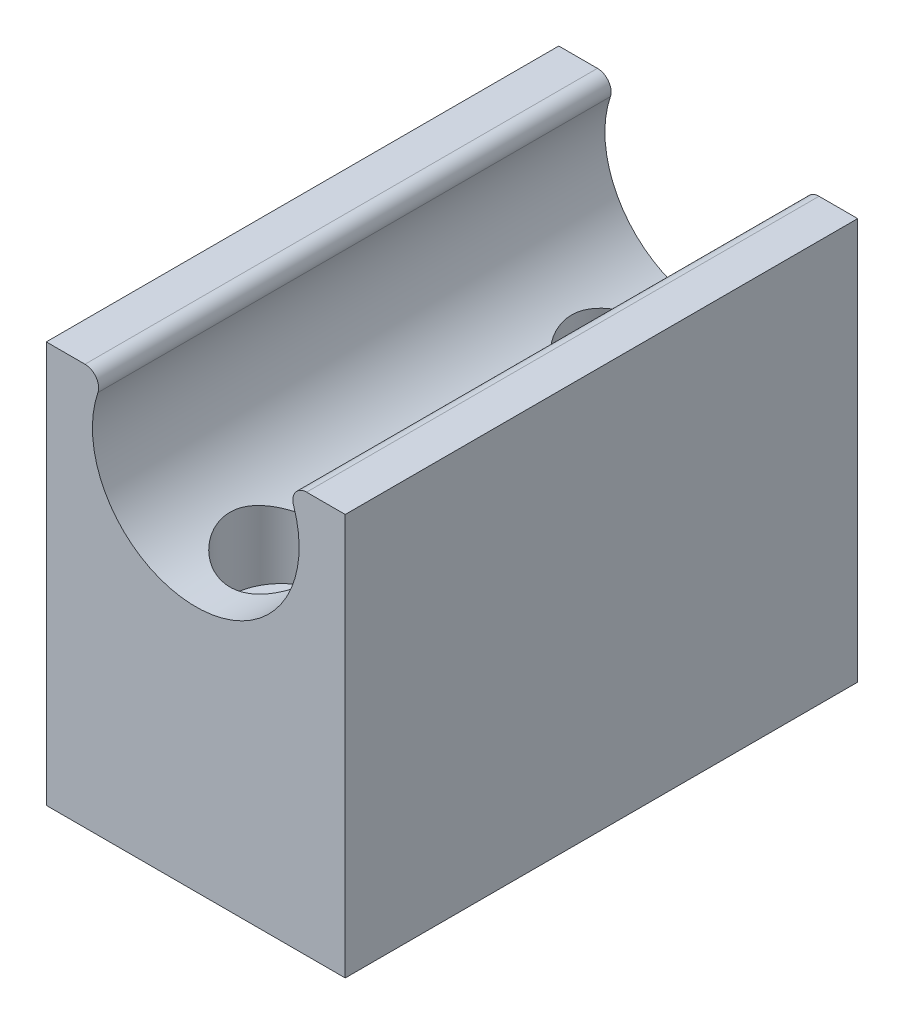
ISO-10303-21;
HEADER;
FILE_DESCRIPTION(('STEP AP214'),'2;1');
FILE_NAME('part.step','',(''),(''),'','','');
FILE_SCHEMA(('AUTOMOTIVE_DESIGN { 1 0 10303 214 1 1 1 1 }'));
ENDSEC;
DATA;
#1=APPLICATION_CONTEXT('core data for automotive mechanical design processes');
#2=APPLICATION_PROTOCOL_DEFINITION('international standard','automotive_design',2000,#1);
#3=PRODUCT_CONTEXT('',#1,'mechanical');
#4=PRODUCT('Part','Part','',(#3));
#5=PRODUCT_RELATED_PRODUCT_CATEGORY('part','',(#4));
#6=PRODUCT_DEFINITION_FORMATION('','',#4);
#7=PRODUCT_DEFINITION_CONTEXT('part definition',#1,'design');
#8=PRODUCT_DEFINITION('design','',#6,#7);
#9=PRODUCT_DEFINITION_SHAPE('','',#8);
#10=(LENGTH_UNIT() NAMED_UNIT(*) SI_UNIT(.MILLI.,.METRE.));
#11=(NAMED_UNIT(*) PLANE_ANGLE_UNIT() SI_UNIT($,.RADIAN.));
#12=(NAMED_UNIT(*) SI_UNIT($,.STERADIAN.) SOLID_ANGLE_UNIT());
#13=UNCERTAINTY_MEASURE_WITH_UNIT(LENGTH_MEASURE(1.E-05),#10,'distance_accuracy_value','');
#14=(GEOMETRIC_REPRESENTATION_CONTEXT(3) GLOBAL_UNCERTAINTY_ASSIGNED_CONTEXT((#13)) GLOBAL_UNIT_ASSIGNED_CONTEXT((#10,
#11,#12)) REPRESENTATION_CONTEXT('',''));
#15=CARTESIAN_POINT('',(0.,0.,0.));
#16=DIRECTION('',(0.,0.,1.));
#17=DIRECTION('',(1.,0.,0.));
#18=AXIS2_PLACEMENT_3D('',#15,#16,#17);
#19=CARTESIAN_POINT('',(-8.75,-11.75,30.));
#20=DIRECTION('',(1.,0.,0.));
#21=DIRECTION('',(0.,0.,-1.));
#22=AXIS2_PLACEMENT_3D('',#19,#20,#21);
#23=PLANE('',#22);
#24=DIRECTION('',(0.,-1.,0.));
#25=VECTOR('',#24,1.);
#26=CARTESIAN_POINT('',(-8.75,-11.75,0.));
#27=LINE('',#26,#25);
#28=CARTESIAN_POINT('',(-8.75,11.75,0.));
#29=VERTEX_POINT('',#28);
#30=CARTESIAN_POINT('',(-8.75,-11.75,0.));
#31=VERTEX_POINT('',#30);
#32=EDGE_CURVE('E125',#29,#31,#27,.T.);
#33=ORIENTED_EDGE('',*,*,#32,.T.);
#34=DIRECTION('',(0.,0.,-1.));
#35=VECTOR('',#34,1.);
#36=CARTESIAN_POINT('',(-8.75,-11.75,30.));
#37=LINE('',#36,#35);
#38=CARTESIAN_POINT('',(-8.75,-11.75,30.));
#39=VERTEX_POINT('',#38);
#40=EDGE_CURVE('E108',#39,#31,#37,.T.);
#41=ORIENTED_EDGE('',*,*,#40,.F.);
#42=DIRECTION('',(0.,-1.,0.));
#43=VECTOR('',#42,1.);
#44=CARTESIAN_POINT('',(-8.75,-11.75,30.));
#45=LINE('',#44,#43);
#46=CARTESIAN_POINT('',(-8.75,11.75,30.));
#47=VERTEX_POINT('',#46);
#48=EDGE_CURVE('E114',#47,#39,#45,.T.);
#49=ORIENTED_EDGE('',*,*,#48,.F.);
#50=DIRECTION('',(0.,0.,-1.));
#51=VECTOR('',#50,1.);
#52=CARTESIAN_POINT('',(-8.75,11.75,30.));
#53=LINE('',#52,#51);
#54=EDGE_CURVE('E207',#47,#29,#53,.T.);
#55=ORIENTED_EDGE('',*,*,#54,.T.);
#56=EDGE_LOOP('',(#33,#41,#49,#55));
#57=FACE_BOUND('',#56,.T.);
#58=ADVANCED_FACE('F34',(#57),#23,.F.);
#59=CARTESIAN_POINT('',(8.75,-11.75,30.));
#60=DIRECTION('',(0.,1.,0.));
#61=DIRECTION('',(-1.,0.,0.));
#62=AXIS2_PLACEMENT_3D('',#59,#60,#61);
#63=PLANE('',#62);
#64=CARTESIAN_POINT('',(0.,-11.75,5.));
#65=DIRECTION('',(0.,1.,0.));
#66=DIRECTION('',(-1.,0.,0.));
#67=AXIS2_PLACEMENT_3D('',#64,#65,#66);
#68=CIRCLE('',#67,1.55);
#69=CARTESIAN_POINT('',(-1.55000000000001,-11.75,5.));
#70=VERTEX_POINT('',#69);
#71=EDGE_CURVE('E238',#70,#70,#68,.T.);
#72=ORIENTED_EDGE('',*,*,#71,.T.);
#73=EDGE_LOOP('',(#72));
#74=FACE_BOUND('',#73,.T.);
#75=CARTESIAN_POINT('',(0.,-11.75,25.));
#76=DIRECTION('',(0.,1.,0.));
#77=DIRECTION('',(-1.,0.,0.));
#78=AXIS2_PLACEMENT_3D('',#75,#76,#77);
#79=CIRCLE('',#78,1.55);
#80=CARTESIAN_POINT('',(-1.55000000000001,-11.75,25.));
#81=VERTEX_POINT('',#80);
#82=EDGE_CURVE('E235',#81,#81,#79,.T.);
#83=ORIENTED_EDGE('',*,*,#82,.T.);
#84=EDGE_LOOP('',(#83));
#85=FACE_BOUND('',#84,.T.);
#86=DIRECTION('',(1.,0.,0.));
#87=VECTOR('',#86,1.);
#88=CARTESIAN_POINT('',(8.75,-11.75,0.));
#89=LINE('',#88,#87);
#90=CARTESIAN_POINT('',(8.75,-11.75,0.));
#91=VERTEX_POINT('',#90);
#92=EDGE_CURVE('E213',#31,#91,#89,.T.);
#93=ORIENTED_EDGE('',*,*,#92,.T.);
#94=DIRECTION('',(0.,0.,-1.));
#95=VECTOR('',#94,1.);
#96=CARTESIAN_POINT('',(8.75,-11.75,30.));
#97=LINE('',#96,#95);
#98=CARTESIAN_POINT('',(8.75,-11.75,30.));
#99=VERTEX_POINT('',#98);
#100=EDGE_CURVE('E111',#99,#91,#97,.T.);
#101=ORIENTED_EDGE('',*,*,#100,.F.);
#102=DIRECTION('',(1.,0.,0.));
#103=VECTOR('',#102,1.);
#104=CARTESIAN_POINT('',(8.75,-11.75,30.));
#105=LINE('',#104,#103);
#106=EDGE_CURVE('E104',#39,#99,#105,.T.);
#107=ORIENTED_EDGE('',*,*,#106,.F.);
#108=ORIENTED_EDGE('',*,*,#40,.T.);
#109=EDGE_LOOP('',(#93,#101,#107,#108));
#110=FACE_BOUND('',#109,.T.);
#111=ADVANCED_FACE('F106',(#74,#85,#110),#63,.F.);
#112=CARTESIAN_POINT('',(8.75,-11.75,30.));
#113=DIRECTION('',(-1.,0.,0.));
#114=DIRECTION('',(0.,0.,1.));
#115=AXIS2_PLACEMENT_3D('',#112,#113,#114);
#116=PLANE('',#115);
#117=DIRECTION('',(0.,1.,0.));
#118=VECTOR('',#117,1.);
#119=CARTESIAN_POINT('',(8.75,-11.75,0.));
#120=LINE('',#119,#118);
#121=CARTESIAN_POINT('',(8.75,11.75,0.));
#122=VERTEX_POINT('',#121);
#123=EDGE_CURVE('E215',#91,#122,#120,.T.);
#124=ORIENTED_EDGE('',*,*,#123,.T.);
#125=DIRECTION('',(0.,0.,-1.));
#126=VECTOR('',#125,1.);
#127=CARTESIAN_POINT('',(8.75,11.75,30.));
#128=LINE('',#127,#126);
#129=CARTESIAN_POINT('',(8.75,11.75,30.));
#130=VERTEX_POINT('',#129);
#131=EDGE_CURVE('E130',#130,#122,#128,.T.);
#132=ORIENTED_EDGE('',*,*,#131,.F.);
#133=DIRECTION('',(0.,1.,0.));
#134=VECTOR('',#133,1.);
#135=CARTESIAN_POINT('',(8.75,-11.75,30.));
#136=LINE('',#135,#134);
#137=EDGE_CURVE('E113',#99,#130,#136,.T.);
#138=ORIENTED_EDGE('',*,*,#137,.F.);
#139=ORIENTED_EDGE('',*,*,#100,.T.);
#140=EDGE_LOOP('',(#124,#132,#138,#139));
#141=FACE_BOUND('',#140,.T.);
#142=ADVANCED_FACE('F187',(#141),#116,.F.);
#143=CARTESIAN_POINT('',(8.75,11.75,30.));
#144=DIRECTION('',(0.,-1.,0.));
#145=DIRECTION('',(1.,0.,0.));
#146=AXIS2_PLACEMENT_3D('',#143,#144,#145);
#147=PLANE('',#146);
#148=DIRECTION('',(-1.,0.,0.));
#149=VECTOR('',#148,1.);
#150=CARTESIAN_POINT('',(8.75,11.75,0.));
#151=LINE('',#150,#149);
#152=CARTESIAN_POINT('',(6.48484038670802,11.75,0.));
#153=VERTEX_POINT('',#152);
#154=EDGE_CURVE('E217',#122,#153,#151,.T.);
#155=ORIENTED_EDGE('',*,*,#154,.T.);
#156=DIRECTION('',(0.,0.,-1.));
#157=VECTOR('',#156,1.);
#158=CARTESIAN_POINT('',(6.48484038670801,11.75,30.));
#159=LINE('',#158,#157);
#160=CARTESIAN_POINT('',(6.48484038670802,11.75,30.));
#161=VERTEX_POINT('',#160);
#162=EDGE_CURVE('E59',#153,#161,#159,.F.);
#163=ORIENTED_EDGE('',*,*,#162,.T.);
#164=DIRECTION('',(-1.,0.,0.));
#165=VECTOR('',#164,1.);
#166=CARTESIAN_POINT('',(8.75,11.75,30.));
#167=LINE('',#166,#165);
#168=EDGE_CURVE('E201',#130,#161,#167,.T.);
#169=ORIENTED_EDGE('',*,*,#168,.F.);
#170=ORIENTED_EDGE('',*,*,#131,.T.);
#171=EDGE_LOOP('',(#155,#163,#169,#170));
#172=FACE_BOUND('',#171,.T.);
#173=ADVANCED_FACE('F180',(#172),#147,.F.);
#174=CARTESIAN_POINT('',(0.,8.74334072432542,30.));
#175=DIRECTION('',(0.,0.,-1.));
#176=DIRECTION('',(-1.,0.,0.));
#177=AXIS2_PLACEMENT_3D('',#174,#175,#176);
#178=CYLINDRICAL_SURFACE('',#177,6.05);
#179=CARTESIAN_POINT('',(-3.00000000000001,3.48953258165406,5.));
#180=CARTESIAN_POINT('',(-2.99999906809475,3.48953157913956,4.92169958919087));
#181=CARTESIAN_POINT('',(-2.99692823095396,3.48777414298011,4.8433884027717));
#182=CARTESIAN_POINT('',(-2.98469593638343,3.48081944162537,4.68738634838371));
#183=CARTESIAN_POINT('',(-2.97553158010728,3.47562053923982,4.60969579347636));
#184=CARTESIAN_POINT('',(-2.93900669661294,3.45509131915615,4.37823264692065));
#185=CARTESIAN_POINT('',(-2.90261462142552,3.43482898217021,4.22621080798807));
#186=CARTESIAN_POINT('',(-2.80775426000345,3.38406506999434,3.93213582389355));
#187=CARTESIAN_POINT('',(-2.74940180836731,3.35361731198791,3.79003493192759));
#188=CARTESIAN_POINT('',(-2.6126308262436,3.28600895912264,3.51764153154146));
#189=CARTESIAN_POINT('',(-2.53421149634938,3.2488480968504,3.38734949383212));
#190=CARTESIAN_POINT('',(-2.35207791908092,3.16831517397319,3.13065008506965));
#191=CARTESIAN_POINT('',(-2.24682870416993,3.12468380986631,3.00541338670911));
#192=CARTESIAN_POINT('',(-2.01721665974257,3.03822100989974,2.77345914021974));
#193=CARTESIAN_POINT('',(-1.89284448548843,2.99538997667303,2.66675070079675));
#194=CARTESIAN_POINT('',(-1.6184786687261,2.9119698406551,2.46799246796855));
#195=CARTESIAN_POINT('',(-1.46733550477812,2.87171550875706,2.37737580991347));
#196=CARTESIAN_POINT('',(-1.14958038611187,2.80134027674662,2.22338801387059));
#197=CARTESIAN_POINT('',(-0.982978114604608,2.77121308718585,2.15999995877159));
#198=CARTESIAN_POINT('',(-0.651423860859746,2.72635339043718,2.06688241456696));
#199=CARTESIAN_POINT('',(-0.487176521968729,2.71068891627855,2.035103075595));
#200=CARTESIAN_POINT('',(-0.154991313461266,2.69304502185751,1.99936086132741));
#201=CARTESIAN_POINT('',(0.0129443057167053,2.69105747710679,1.99538147204299));
#202=CARTESIAN_POINT('',(0.332354445423699,2.70054388500346,2.0145461562578));
#203=CARTESIAN_POINT('',(0.484007962523596,2.71088057898079,2.035398591201));
#204=CARTESIAN_POINT('',(0.781333146292692,2.74214340899169,2.09954285160153));
#205=CARTESIAN_POINT('',(0.927004365054741,2.76307033638098,2.14283635397461));
#206=CARTESIAN_POINT('',(1.21079360349511,2.81395853569769,2.25093276304642));
#207=CARTESIAN_POINT('',(1.3487772176401,2.84404226606314,2.31602850637883));
#208=CARTESIAN_POINT('',(1.61219900252272,2.91052002855572,2.46548322192162));
#209=CARTESIAN_POINT('',(1.7376326351692,2.94691633040679,2.5498491263071));
#210=CARTESIAN_POINT('',(1.98489139887648,3.02660097643339,2.74451485261607));
#211=CARTESIAN_POINT('',(2.10528603368982,3.07021552937018,2.85650064321701));
#212=CARTESIAN_POINT('',(2.32634259539988,3.15721781997606,3.09866712688479));
#213=CARTESIAN_POINT('',(2.42698977332745,3.2006053647349,3.22886129604987));
#214=CARTESIAN_POINT('',(2.61181236808332,3.28514372249205,3.51375228475325));
#215=CARTESIAN_POINT('',(2.69458875370376,3.32599147028795,3.66946515757608));
#216=CARTESIAN_POINT('',(2.79773152700655,3.37894993238942,3.91347968465842));
#217=CARTESIAN_POINT('',(2.82861305914926,3.39521974926586,3.99657713022711));
#218=CARTESIAN_POINT('',(2.88302399044353,3.42435327138516,4.16570628855268));
#219=CARTESIAN_POINT('',(2.90655788697888,3.43721905944712,4.25173617049391));
#220=CARTESIAN_POINT('',(2.94439298418654,3.45812739382683,4.41919564061344));
#221=CARTESIAN_POINT('',(2.95927300565853,3.46646881462058,4.50045769692464));
#222=CARTESIAN_POINT('',(2.98229098239219,3.47944333667072,4.66418766032683));
#223=CARTESIAN_POINT('',(2.99043241562099,3.48407835086161,4.74665492298273));
#224=CARTESIAN_POINT('',(2.99985479803173,3.48944662144606,4.9120840314402));
#225=CARTESIAN_POINT('',(3.00113816073897,3.49018125048141,4.99504569295921));
#226=CARTESIAN_POINT('',(2.99683992542914,3.48772962864214,5.16070691994721));
#227=CARTESIAN_POINT('',(2.99125877282282,3.48454363216111,5.24340650207242));
#228=CARTESIAN_POINT('',(2.9662363390353,3.47035895456734,5.4724269839308));
#229=CARTESIAN_POINT('',(2.93935618478279,3.455191754699,5.61775608758309));
#230=CARTESIAN_POINT('',(2.86511831894805,3.41461276501557,5.90147917235802));
#231=CARTESIAN_POINT('',(2.8177541113851,3.38919772553983,6.03987093793691));
#232=CARTESIAN_POINT('',(2.70158216238737,3.32961789660782,6.31320616371009));
#233=CARTESIAN_POINT('',(2.63188161552254,3.29510191178194,6.44769186293141));
#234=CARTESIAN_POINT('',(2.47379628699685,3.22152697776825,6.70382415113317));
#235=CARTESIAN_POINT('',(2.38540193064304,3.18246570518016,6.82546411266343));
#236=CARTESIAN_POINT('',(2.17966693882561,3.09839991039797,7.06818278242263));
#237=CARTESIAN_POINT('',(2.06009917998589,3.05325741473383,7.18733486504638));
#238=CARTESIAN_POINT('',(1.80193286915294,2.96630981713788,7.40447397825602));
#239=CARTESIAN_POINT('',(1.66332824552304,2.92450578673379,7.5024542305182));
#240=CARTESIAN_POINT('',(1.36627957215119,2.84759121188405,7.67649285211116));
#241=CARTESIAN_POINT('',(1.20742925954394,2.81267203405631,7.75194834478087));
#242=CARTESIAN_POINT('',(0.87706101921446,2.75491127579537,7.87432043564501));
#243=CARTESIAN_POINT('',(0.705554178032903,2.73205926489916,7.92126168590921));
#244=CARTESIAN_POINT('',(0.37155100032505,2.70264753034033,7.98128875886027));
#245=CARTESIAN_POINT('',(0.209650096715313,2.69479710701199,7.99706115372735));
#246=CARTESIAN_POINT('',(-0.114649777075985,2.69225728281536,8.00218671215331));
#247=CARTESIAN_POINT('',(-0.277048560137958,2.69756342842318,7.99154881564504));
#248=CARTESIAN_POINT('',(-0.586778482700871,2.71998790279766,7.94595117695327));
#249=CARTESIAN_POINT('',(-0.734408053014399,2.73632696613152,7.91259479624071));
#250=CARTESIAN_POINT('',(-1.02174485627361,2.77847380468405,7.82464556498565));
#251=CARTESIAN_POINT('',(-1.16145093163362,2.80428295934582,7.7700496205521));
#252=CARTESIAN_POINT('',(-1.43574865278082,2.8644210499404,7.63870224312811));
#253=CARTESIAN_POINT('',(-1.56985828254569,2.89907000153997,7.56109522952421));
#254=CARTESIAN_POINT('',(-1.82371481519904,2.97323838355409,7.38700154070093));
#255=CARTESIAN_POINT('',(-1.94345506734849,3.01276005223672,7.2905061771253));
#256=CARTESIAN_POINT('',(-2.17753140543737,3.09729599644537,7.07042250074851));
#257=CARTESIAN_POINT('',(-2.29018595430991,3.14246882951173,6.9451052704169));
#258=CARTESIAN_POINT('',(-2.49350662440992,3.22997466248258,6.67653596788057));
#259=CARTESIAN_POINT('',(-2.5841538376268,3.27230519794687,6.53326863258302));
#260=CARTESIAN_POINT('',(-2.7026618493872,3.33038077366505,6.30509672838674));
#261=CARTESIAN_POINT('',(-2.73965739745578,3.34906593554201,6.22556757982067));
#262=CARTESIAN_POINT('',(-2.8067064671721,3.38364657678948,6.06306692411298));
#263=CARTESIAN_POINT('',(-2.83676356155061,3.39954349085993,5.98009721465641));
#264=CARTESIAN_POINT('',(-2.88950286251377,3.42787565515903,5.81151459588914));
#265=CARTESIAN_POINT('',(-2.91220409038983,3.44031982154721,5.72590914097619));
#266=CARTESIAN_POINT('',(-2.94999720196722,3.46124962907184,5.55260406566714));
#267=CARTESIAN_POINT('',(-2.96509443701473,3.46973805376498,5.46490596363331));
#268=CARTESIAN_POINT('',(-2.9841585341751,3.48051105265958,5.31424298296345));
#269=CARTESIAN_POINT('',(-2.99009363222025,3.48388631132452,5.25159698145113));
#270=CARTESIAN_POINT('',(-2.99801486981297,3.48839755268586,5.1259696588871));
#271=CARTESIAN_POINT('',(-3.00000074966585,3.4895333881211,5.06298831605687));
#272=CARTESIAN_POINT('',(-3.00000000000001,3.48953258165406,5.));
#273=B_SPLINE_CURVE_WITH_KNOTS('',3,(#179,#180,#181,#182,#183,#184,#185,#186,#187,#188,#189,
#190,#191,#192,#193,#194,#195,#196,#197,#198,#199,#200,#201,#202,#203,#204,#205,#206,#207,#208,
#209,#210,#211,#212,#213,#214,#215,#216,#217,#218,#219,#220,#221,#222,#223,#224,#225,#226,#227,
#228,#229,#230,#231,#232,#233,#234,#235,#236,#237,#238,#239,#240,#241,#242,#243,#244,#245,#246,
#247,#248,#249,#250,#251,#252,#253,#254,#255,#256,#257,#258,#259,#260,#261,#262,#263,#264,#265,
#266,#267,#268,#269,#270,#271,#272),.UNSPECIFIED.,.T.,.F.,(4,2,2,2,2,2,2,2,2,2,2,2,2,2,2,2,2,2,
2,2,2,2,2,2,2,2,2,2,2,2,2,2,2,2,2,2,2,2,2,2,2,2,2,2,2,2,4),(0.,0.234832216291769,
0.469776228416026,0.940084921369962,1.40794687267444,1.87582746515457,2.38162825856337,
2.88767700975197,3.42713981376168,3.96626696343198,4.46756050795178,4.96855624400314,
5.42668515066377,5.88484829608603,6.34943002572839,6.81417914620369,7.3223226734741,
7.83084428994023,8.37073413562579,8.64079160168459,8.91068344385044,9.15943377973968,
9.40805564867155,9.65659001563011,9.90510825704555,10.3486118593694,10.792256210488,
11.256480421302,11.7209429792526,12.2427974264193,12.7648187025477,13.2997656797885,
13.8342495063932,14.320212475525,14.8060109677164,15.2606580113594,15.7153713066187,
16.1897374121279,16.664322233839,17.1854483024488,17.7070205341594,17.9757512635118,
18.2443433085238,18.5122351623385,18.7799382216341,18.9688352289957,19.1577446575321),.UNSPECIFIED.);
#274=CARTESIAN_POINT('',(-3.00000000000001,3.48953258165406,5.));
#275=VERTEX_POINT('',#274);
#276=EDGE_CURVE('E151',#275,#275,#273,.T.);
#277=ORIENTED_EDGE('',*,*,#276,.T.);
#278=EDGE_LOOP('',(#277));
#279=FACE_BOUND('',#278,.T.);
#280=CARTESIAN_POINT('',(-3.00000000000001,3.48953258165406,25.));
#281=CARTESIAN_POINT('',(-2.99999906809475,3.48953157913956,24.9216995891909));
#282=CARTESIAN_POINT('',(-2.99692823095396,3.48777414298011,24.8433884027717));
#283=CARTESIAN_POINT('',(-2.98469593638343,3.48081944162537,24.6873863483837));
#284=CARTESIAN_POINT('',(-2.97553158010728,3.47562053923982,24.6096957934764));
#285=CARTESIAN_POINT('',(-2.93900669661294,3.45509131915615,24.3782326469206));
#286=CARTESIAN_POINT('',(-2.90261462142552,3.43482898217021,24.2262108079881));
#287=CARTESIAN_POINT('',(-2.80775426000345,3.38406506999434,23.9321358238935));
#288=CARTESIAN_POINT('',(-2.74940180836731,3.35361731198791,23.7900349319276));
#289=CARTESIAN_POINT('',(-2.61263082624361,3.28600895912264,23.5176415315415));
#290=CARTESIAN_POINT('',(-2.53421149634938,3.2488480968504,23.3873494938321));
#291=CARTESIAN_POINT('',(-2.35207791908092,3.16831517397319,23.1306500850696));
#292=CARTESIAN_POINT('',(-2.24682870416993,3.12468380986631,23.0054133867091));
#293=CARTESIAN_POINT('',(-2.01721665974257,3.03822100989974,22.7734591402197));
#294=CARTESIAN_POINT('',(-1.89284448548843,2.99538997667303,22.6667507007967));
#295=CARTESIAN_POINT('',(-1.6184786687261,2.9119698406551,22.4679924679685));
#296=CARTESIAN_POINT('',(-1.46733550477812,2.87171550875706,22.3773758099135));
#297=CARTESIAN_POINT('',(-1.14958038611187,2.80134027674662,22.2233880138706));
#298=CARTESIAN_POINT('',(-0.982978114604611,2.77121308718585,22.1599999587716));
#299=CARTESIAN_POINT('',(-0.651423860859749,2.72635339043719,22.066882414567));
#300=CARTESIAN_POINT('',(-0.487176521968732,2.71068891627855,22.035103075595));
#301=CARTESIAN_POINT('',(-0.154991313461269,2.69304502185751,21.9993608613274));
#302=CARTESIAN_POINT('',(0.012944305716702,2.69105747710679,21.995381472043));
#303=CARTESIAN_POINT('',(0.332354445423696,2.70054388500346,22.0145461562578));
#304=CARTESIAN_POINT('',(0.484007962523593,2.71088057898079,22.035398591201));
#305=CARTESIAN_POINT('',(0.781333146292688,2.74214340899169,22.0995428516015));
#306=CARTESIAN_POINT('',(0.927004365054738,2.76307033638098,22.1428363539746));
#307=CARTESIAN_POINT('',(1.21079360349511,2.81395853569769,22.2509327630464));
#308=CARTESIAN_POINT('',(1.34877721764009,2.84404226606313,22.3160285063788));
#309=CARTESIAN_POINT('',(1.61219900252272,2.91052002855572,22.4654832219216));
#310=CARTESIAN_POINT('',(1.7376326351692,2.94691633040679,22.5498491263071));
#311=CARTESIAN_POINT('',(1.98489139887647,3.02660097643338,22.7445148526161));
#312=CARTESIAN_POINT('',(2.10528603368981,3.07021552937018,22.856500643217));
#313=CARTESIAN_POINT('',(2.32634259539987,3.15721781997606,23.0986671268848));
#314=CARTESIAN_POINT('',(2.42698977332745,3.2006053647349,23.2288612960499));
#315=CARTESIAN_POINT('',(2.61181236808332,3.28514372249205,23.5137522847533));
#316=CARTESIAN_POINT('',(2.69458875370376,3.32599147028795,23.6694651575761));
#317=CARTESIAN_POINT('',(2.79773152700655,3.37894993238942,23.9134796846584));
#318=CARTESIAN_POINT('',(2.82861305914926,3.39521974926586,23.9965771302271));
#319=CARTESIAN_POINT('',(2.88302399044353,3.42435327138516,24.1657062885527));
#320=CARTESIAN_POINT('',(2.90655788697888,3.43721905944712,24.2517361704939));
#321=CARTESIAN_POINT('',(2.94439298418654,3.45812739382683,24.4191956406134));
#322=CARTESIAN_POINT('',(2.95927300565853,3.46646881462058,24.5004576969246));
#323=CARTESIAN_POINT('',(2.98229098239219,3.47944333667072,24.6641876603268));
#324=CARTESIAN_POINT('',(2.99043241562099,3.48407835086161,24.7466549229827));
#325=CARTESIAN_POINT('',(2.99985479803173,3.48944662144606,24.9120840314402));
#326=CARTESIAN_POINT('',(3.00113816073897,3.49018125048141,24.9950456929592));
#327=CARTESIAN_POINT('',(2.99683992542914,3.48772962864215,25.1607069199472));
#328=CARTESIAN_POINT('',(2.99125877282282,3.48454363216112,25.2434065020724));
#329=CARTESIAN_POINT('',(2.9662363390353,3.47035895456734,25.4724269839308));
#330=CARTESIAN_POINT('',(2.93935618478279,3.455191754699,25.6177560875831));
#331=CARTESIAN_POINT('',(2.86511831894805,3.41461276501557,25.901479172358));
#332=CARTESIAN_POINT('',(2.8177541113851,3.38919772553983,26.0398709379369));
#333=CARTESIAN_POINT('',(2.70158216238737,3.32961789660782,26.3132061637101));
#334=CARTESIAN_POINT('',(2.63188161552254,3.29510191178194,26.4476918629314));
#335=CARTESIAN_POINT('',(2.47379628699685,3.22152697776825,26.7038241511332));
#336=CARTESIAN_POINT('',(2.38540193064304,3.18246570518016,26.8254641126634));
#337=CARTESIAN_POINT('',(2.17966693882561,3.09839991039797,27.0681827824226));
#338=CARTESIAN_POINT('',(2.0600991799859,3.05325741473383,27.1873348650464));
#339=CARTESIAN_POINT('',(1.80193286915294,2.96630981713788,27.404473978256));
#340=CARTESIAN_POINT('',(1.66332824552304,2.92450578673379,27.5024542305182));
#341=CARTESIAN_POINT('',(1.36627957215119,2.84759121188406,27.6764928521112));
#342=CARTESIAN_POINT('',(1.20742925954394,2.81267203405631,27.7519483447809));
#343=CARTESIAN_POINT('',(0.877061019214466,2.75491127579537,27.874320435645));
#344=CARTESIAN_POINT('',(0.705554178032909,2.73205926489916,27.9212616859092));
#345=CARTESIAN_POINT('',(0.371551000325056,2.70264753034033,27.9812887588603));
#346=CARTESIAN_POINT('',(0.209650096715318,2.69479710701199,27.9970611537273));
#347=CARTESIAN_POINT('',(-0.114649777075981,2.69225728281536,28.0021867121533));
#348=CARTESIAN_POINT('',(-0.277048560137953,2.69756342842318,27.991548815645));
#349=CARTESIAN_POINT('',(-0.586778482700867,2.71998790279765,27.9459511769533));
#350=CARTESIAN_POINT('',(-0.734408053014395,2.73632696613151,27.9125947962407));
#351=CARTESIAN_POINT('',(-1.02174485627361,2.77847380468405,27.8246455649857));
#352=CARTESIAN_POINT('',(-1.16145093163361,2.80428295934582,27.7700496205521));
#353=CARTESIAN_POINT('',(-1.43574865278081,2.8644210499404,27.6387022431281));
#354=CARTESIAN_POINT('',(-1.56985828254569,2.89907000153997,27.5610952295242));
#355=CARTESIAN_POINT('',(-1.82371481519904,2.9732383835541,27.3870015407009));
#356=CARTESIAN_POINT('',(-1.94345506734849,3.01276005223672,27.2905061771253));
#357=CARTESIAN_POINT('',(-2.17753140543736,3.09729599644537,27.0704225007485));
#358=CARTESIAN_POINT('',(-2.2901859543099,3.14246882951173,26.9451052704169));
#359=CARTESIAN_POINT('',(-2.49350662440992,3.22997466248258,26.6765359678806));
#360=CARTESIAN_POINT('',(-2.58415383762679,3.27230519794686,26.533268632583));
#361=CARTESIAN_POINT('',(-2.7026618493872,3.33038077366505,26.3050967283867));
#362=CARTESIAN_POINT('',(-2.73965739745577,3.34906593554201,26.2255675798207));
#363=CARTESIAN_POINT('',(-2.80670646717209,3.38364657678947,26.063066924113));
#364=CARTESIAN_POINT('',(-2.8367635615506,3.39954349085993,25.9800972146564));
#365=CARTESIAN_POINT('',(-2.88950286251377,3.42787565515903,25.8115145958891));
#366=CARTESIAN_POINT('',(-2.91220409038983,3.44031982154721,25.7259091409762));
#367=CARTESIAN_POINT('',(-2.94999720196722,3.46124962907184,25.5526040656671));
#368=CARTESIAN_POINT('',(-2.96509443701473,3.46973805376498,25.4649059636333));
#369=CARTESIAN_POINT('',(-2.9841585341751,3.48051105265958,25.3142429829635));
#370=CARTESIAN_POINT('',(-2.99009363222025,3.48388631132452,25.2515969814511));
#371=CARTESIAN_POINT('',(-2.99801486981297,3.48839755268586,25.1259696588871));
#372=CARTESIAN_POINT('',(-3.00000074966585,3.4895333881211,25.0629883160569));
#373=CARTESIAN_POINT('',(-3.00000000000001,3.48953258165406,25.));
#374=B_SPLINE_CURVE_WITH_KNOTS('',3,(#280,#281,#282,#283,#284,#285,#286,#287,#288,#289,#290,
#291,#292,#293,#294,#295,#296,#297,#298,#299,#300,#301,#302,#303,#304,#305,#306,#307,#308,#309,
#310,#311,#312,#313,#314,#315,#316,#317,#318,#319,#320,#321,#322,#323,#324,#325,#326,#327,#328,
#329,#330,#331,#332,#333,#334,#335,#336,#337,#338,#339,#340,#341,#342,#343,#344,#345,#346,#347,
#348,#349,#350,#351,#352,#353,#354,#355,#356,#357,#358,#359,#360,#361,#362,#363,#364,#365,#366,
#367,#368,#369,#370,#371,#372,#373),.UNSPECIFIED.,.T.,.F.,(4,2,2,2,2,2,2,2,2,2,2,2,2,2,2,2,2,2,
2,2,2,2,2,2,2,2,2,2,2,2,2,2,2,2,2,2,2,2,2,2,2,2,2,2,2,2,4),(0.,0.234832216291769,
0.469776228416024,0.94008492136996,1.40794687267444,1.87582746515457,2.38162825856336,
2.88767700975197,3.42713981376167,3.96626696343198,4.46756050795177,4.96855624400314,
5.42668515066376,5.88484829608603,6.34943002572839,6.81417914620369,7.3223226734741,
7.83084428994023,8.3707341356258,8.64079160168459,8.91068344385043,9.15943377973968,
9.40805564867155,9.6565900156301,9.90510825704555,10.3486118593694,10.792256210488,
11.256480421302,11.7209429792526,12.2427974264193,12.7648187025477,13.2997656797885,
13.8342495063932,14.320212475525,14.8060109677164,15.2606580113594,15.7153713066187,
16.1897374121279,16.664322233839,17.1854483024488,17.7070205341594,17.9757512635118,
18.2443433085238,18.5122351623385,18.7799382216341,18.9688352289957,19.1577446575321),.UNSPECIFIED.);
#375=CARTESIAN_POINT('',(-3.00000000000001,3.48953258165406,25.));
#376=VERTEX_POINT('',#375);
#377=EDGE_CURVE('E143',#376,#376,#374,.T.);
#378=ORIENTED_EDGE('',*,*,#377,.T.);
#379=EDGE_LOOP('',(#378));
#380=FACE_BOUND('',#379,.T.);
#381=CARTESIAN_POINT('',(0.,8.74334072432542,30.));
#382=DIRECTION('',(0.,0.,-1.));
#383=DIRECTION('',(1.,0.,0.));
#384=AXIS2_PLACEMENT_3D('',#381,#382,#383);
#385=CIRCLE('',#384,6.05);
#386=CARTESIAN_POINT('',(5.7274867649027,10.6922879678044,30.));
#387=VERTEX_POINT('',#386);
#388=CARTESIAN_POINT('',(-5.7274867649027,10.6922879678044,30.));
#389=VERTEX_POINT('',#388);
#390=EDGE_CURVE('E200',#387,#389,#385,.T.);
#391=ORIENTED_EDGE('',*,*,#390,.F.);
#392=DIRECTION('',(0.,0.,-1.));
#393=VECTOR('',#392,1.);
#394=CARTESIAN_POINT('',(5.7274867649027,10.6922879678044,30.));
#395=LINE('',#394,#393);
#396=CARTESIAN_POINT('',(5.7274867649027,10.6922879678044,0.));
#397=VERTEX_POINT('',#396);
#398=EDGE_CURVE('E128',#387,#397,#395,.T.);
#399=ORIENTED_EDGE('',*,*,#398,.T.);
#400=CARTESIAN_POINT('',(0.,8.74334072432542,0.));
#401=DIRECTION('',(0.,0.,-1.));
#402=DIRECTION('',(1.,0.,0.));
#403=AXIS2_PLACEMENT_3D('',#400,#401,#402);
#404=CIRCLE('',#403,6.05);
#405=CARTESIAN_POINT('',(-5.7274867649027,10.6922879678044,0.));
#406=VERTEX_POINT('',#405);
#407=EDGE_CURVE('E219',#397,#406,#404,.T.);
#408=ORIENTED_EDGE('',*,*,#407,.T.);
#409=DIRECTION('',(0.,0.,-1.));
#410=VECTOR('',#409,1.);
#411=CARTESIAN_POINT('',(-5.7274867649027,10.6922879678044,30.));
#412=LINE('',#411,#410);
#413=EDGE_CURVE('E126',#406,#389,#412,.F.);
#414=ORIENTED_EDGE('',*,*,#413,.T.);
#415=EDGE_LOOP('',(#391,#399,#408,#414));
#416=FACE_BOUND('',#415,.T.);
#417=ADVANCED_FACE('F157',(#279,#380,#416),#178,.F.);
#418=CARTESIAN_POINT('',(-5.25,11.75,30.));
#419=DIRECTION('',(0.,-1.,0.));
#420=DIRECTION('',(1.,0.,0.));
#421=AXIS2_PLACEMENT_3D('',#418,#419,#420);
#422=PLANE('',#421);
#423=DIRECTION('',(-1.,0.,0.));
#424=VECTOR('',#423,1.);
#425=CARTESIAN_POINT('',(-5.25,11.75,30.));
#426=LINE('',#425,#424);
#427=CARTESIAN_POINT('',(-6.48484038670802,11.75,30.));
#428=VERTEX_POINT('',#427);
#429=EDGE_CURVE('E118',#428,#47,#426,.T.);
#430=ORIENTED_EDGE('',*,*,#429,.F.);
#431=DIRECTION('',(0.,0.,-1.));
#432=VECTOR('',#431,1.);
#433=CARTESIAN_POINT('',(-6.48484038670802,11.75,30.));
#434=LINE('',#433,#432);
#435=CARTESIAN_POINT('',(-6.48484038670802,11.75,0.));
#436=VERTEX_POINT('',#435);
#437=EDGE_CURVE('E11',#428,#436,#434,.T.);
#438=ORIENTED_EDGE('',*,*,#437,.T.);
#439=DIRECTION('',(-1.,0.,0.));
#440=VECTOR('',#439,1.);
#441=CARTESIAN_POINT('',(-5.25,11.75,0.));
#442=LINE('',#441,#440);
#443=EDGE_CURVE('E122',#436,#29,#442,.T.);
#444=ORIENTED_EDGE('',*,*,#443,.T.);
#445=ORIENTED_EDGE('',*,*,#54,.F.);
#446=EDGE_LOOP('',(#430,#438,#444,#445));
#447=FACE_BOUND('',#446,.T.);
#448=ADVANCED_FACE('F171',(#447),#422,.F.);
#449=CARTESIAN_POINT('',(0.,8.74334072432542,30.));
#450=DIRECTION('',(0.,0.,1.));
#451=DIRECTION('',(1.,0.,0.));
#452=AXIS2_PLACEMENT_3D('',#449,#450,#451);
#453=PLANE('',#452);
#454=ORIENTED_EDGE('',*,*,#168,.T.);
#455=CARTESIAN_POINT('',(6.48484038670801,10.95,30.));
#456=DIRECTION('',(0.,0.,1.));
#457=DIRECTION('',(1.,0.,0.));
#458=AXIS2_PLACEMENT_3D('',#455,#456,#457);
#459=CIRCLE('',#458,0.8);
#460=EDGE_CURVE('E43',#161,#387,#459,.T.);
#461=ORIENTED_EDGE('',*,*,#460,.T.);
#462=ORIENTED_EDGE('',*,*,#390,.T.);
#463=CARTESIAN_POINT('',(-6.48484038670801,10.95,30.));
#464=DIRECTION('',(0.,0.,1.));
#465=DIRECTION('',(1.,0.,0.));
#466=AXIS2_PLACEMENT_3D('',#463,#464,#465);
#467=CIRCLE('',#466,0.8);
#468=EDGE_CURVE('E51',#389,#428,#467,.T.);
#469=ORIENTED_EDGE('',*,*,#468,.T.);
#470=ORIENTED_EDGE('',*,*,#429,.T.);
#471=ORIENTED_EDGE('',*,*,#48,.T.);
#472=ORIENTED_EDGE('',*,*,#106,.T.);
#473=ORIENTED_EDGE('',*,*,#137,.T.);
#474=EDGE_LOOP('',(#454,#461,#462,#469,#470,#471,#472,#473));
#475=FACE_BOUND('',#474,.T.);
#476=ADVANCED_FACE('F117',(#475),#453,.T.);
#477=CARTESIAN_POINT('',(0.,8.74334072432542,0.));
#478=DIRECTION('',(0.,0.,1.));
#479=DIRECTION('',(1.,0.,0.));
#480=AXIS2_PLACEMENT_3D('',#477,#478,#479);
#481=PLANE('',#480);
#482=ORIENTED_EDGE('',*,*,#407,.F.);
#483=CARTESIAN_POINT('',(6.48484038670801,10.95,0.));
#484=DIRECTION('',(0.,0.,1.));
#485=DIRECTION('',(1.,0.,0.));
#486=AXIS2_PLACEMENT_3D('',#483,#484,#485);
#487=CIRCLE('',#486,0.8);
#488=EDGE_CURVE('E138',#397,#153,#487,.F.);
#489=ORIENTED_EDGE('',*,*,#488,.T.);
#490=ORIENTED_EDGE('',*,*,#154,.F.);
#491=ORIENTED_EDGE('',*,*,#123,.F.);
#492=ORIENTED_EDGE('',*,*,#92,.F.);
#493=ORIENTED_EDGE('',*,*,#32,.F.);
#494=ORIENTED_EDGE('',*,*,#443,.F.);
#495=CARTESIAN_POINT('',(-6.48484038670801,10.95,0.));
#496=DIRECTION('',(0.,0.,1.));
#497=DIRECTION('',(1.,0.,0.));
#498=AXIS2_PLACEMENT_3D('',#495,#496,#497);
#499=CIRCLE('',#498,0.8);
#500=EDGE_CURVE('E136',#436,#406,#499,.F.);
#501=ORIENTED_EDGE('',*,*,#500,.T.);
#502=EDGE_LOOP('',(#482,#489,#490,#491,#492,#493,#494,#501));
#503=FACE_BOUND('',#502,.T.);
#504=ADVANCED_FACE('F170',(#503),#481,.F.);
#505=CARTESIAN_POINT('',(6.48484038670801,10.95,30.));
#506=DIRECTION('',(0.,0.,-1.));
#507=DIRECTION('',(-1.,0.,0.));
#508=AXIS2_PLACEMENT_3D('',#505,#506,#507);
#509=CYLINDRICAL_SURFACE('',#508,0.8);
#510=ORIENTED_EDGE('',*,*,#460,.F.);
#511=ORIENTED_EDGE('',*,*,#162,.F.);
#512=ORIENTED_EDGE('',*,*,#488,.F.);
#513=ORIENTED_EDGE('',*,*,#398,.F.);
#514=EDGE_LOOP('',(#510,#511,#512,#513));
#515=FACE_BOUND('',#514,.T.);
#516=ADVANCED_FACE('F173',(#515),#509,.T.);
#517=CARTESIAN_POINT('',(-6.48484038670801,10.95,30.));
#518=DIRECTION('',(0.,0.,-1.));
#519=DIRECTION('',(-1.,0.,0.));
#520=AXIS2_PLACEMENT_3D('',#517,#518,#519);
#521=CYLINDRICAL_SURFACE('',#520,0.8);
#522=ORIENTED_EDGE('',*,*,#468,.F.);
#523=ORIENTED_EDGE('',*,*,#413,.F.);
#524=ORIENTED_EDGE('',*,*,#500,.F.);
#525=ORIENTED_EDGE('',*,*,#437,.F.);
#526=EDGE_LOOP('',(#522,#523,#524,#525));
#527=FACE_BOUND('',#526,.T.);
#528=ADVANCED_FACE('F36',(#527),#521,.T.);
#529=CARTESIAN_POINT('',(0.,-0.749999999999992,25.));
#530=DIRECTION('',(0.,1.,0.));
#531=DIRECTION('',(-1.,0.,0.));
#532=AXIS2_PLACEMENT_3D('',#529,#530,#531);
#533=CYLINDRICAL_SURFACE('',#532,3.);
#534=CARTESIAN_POINT('',(0.,-0.749999999999992,25.));
#535=DIRECTION('',(0.,1.,0.));
#536=DIRECTION('',(-1.,0.,0.));
#537=AXIS2_PLACEMENT_3D('',#534,#535,#536);
#538=CIRCLE('',#537,3.);
#539=CARTESIAN_POINT('',(-3.00000000000001,-0.749999999999993,25.));
#540=VERTEX_POINT('',#539);
#541=EDGE_CURVE('E230',#540,#540,#538,.T.);
#542=ORIENTED_EDGE('',*,*,#541,.F.);
#543=EDGE_LOOP('',(#542));
#544=FACE_BOUND('',#543,.T.);
#545=ORIENTED_EDGE('',*,*,#377,.F.);
#546=EDGE_LOOP('',(#545));
#547=FACE_BOUND('',#546,.T.);
#548=ADVANCED_FACE('F161',(#544,#547),#533,.F.);
#549=CARTESIAN_POINT('',(0.,-0.749999999999992,25.));
#550=DIRECTION('',(0.,1.,0.));
#551=DIRECTION('',(-1.,0.,0.));
#552=AXIS2_PLACEMENT_3D('',#549,#550,#551);
#553=PLANE('',#552);
#554=CARTESIAN_POINT('',(0.,-0.749999999999992,25.));
#555=DIRECTION('',(0.,1.,0.));
#556=DIRECTION('',(-1.,0.,0.));
#557=AXIS2_PLACEMENT_3D('',#554,#555,#556);
#558=CIRCLE('',#557,1.55);
#559=CARTESIAN_POINT('',(-1.55000000000001,-0.749999999999994,25.));
#560=VERTEX_POINT('',#559);
#561=EDGE_CURVE('E38',#560,#560,#558,.T.);
#562=ORIENTED_EDGE('',*,*,#561,.F.);
#563=EDGE_LOOP('',(#562));
#564=FACE_BOUND('',#563,.T.);
#565=ORIENTED_EDGE('',*,*,#541,.T.);
#566=EDGE_LOOP('',(#565));
#567=FACE_BOUND('',#566,.T.);
#568=ADVANCED_FACE('F166',(#564,#567),#553,.T.);
#569=CARTESIAN_POINT('',(0.,-0.749999999999992,5.));
#570=DIRECTION('',(0.,1.,0.));
#571=DIRECTION('',(-1.,0.,0.));
#572=AXIS2_PLACEMENT_3D('',#569,#570,#571);
#573=CYLINDRICAL_SURFACE('',#572,3.);
#574=CARTESIAN_POINT('',(0.,-0.749999999999992,5.));
#575=DIRECTION('',(0.,1.,0.));
#576=DIRECTION('',(-1.,0.,0.));
#577=AXIS2_PLACEMENT_3D('',#574,#575,#576);
#578=CIRCLE('',#577,3.);
#579=CARTESIAN_POINT('',(-3.00000000000001,-0.749999999999993,5.));
#580=VERTEX_POINT('',#579);
#581=EDGE_CURVE('E152',#580,#580,#578,.T.);
#582=ORIENTED_EDGE('',*,*,#581,.F.);
#583=EDGE_LOOP('',(#582));
#584=FACE_BOUND('',#583,.T.);
#585=ORIENTED_EDGE('',*,*,#276,.F.);
#586=EDGE_LOOP('',(#585));
#587=FACE_BOUND('',#586,.T.);
#588=ADVANCED_FACE('F253',(#584,#587),#573,.F.);
#589=CARTESIAN_POINT('',(0.,-0.749999999999992,5.));
#590=DIRECTION('',(0.,1.,0.));
#591=DIRECTION('',(-1.,0.,0.));
#592=AXIS2_PLACEMENT_3D('',#589,#590,#591);
#593=PLANE('',#592);
#594=CARTESIAN_POINT('',(0.,-0.749999999999992,5.));
#595=DIRECTION('',(0.,1.,0.));
#596=DIRECTION('',(-1.,0.,0.));
#597=AXIS2_PLACEMENT_3D('',#594,#595,#596);
#598=CIRCLE('',#597,1.55);
#599=CARTESIAN_POINT('',(-1.55000000000001,-0.749999999999994,5.));
#600=VERTEX_POINT('',#599);
#601=EDGE_CURVE('E240',#600,#600,#598,.T.);
#602=ORIENTED_EDGE('',*,*,#601,.F.);
#603=EDGE_LOOP('',(#602));
#604=FACE_BOUND('',#603,.T.);
#605=ORIENTED_EDGE('',*,*,#581,.T.);
#606=EDGE_LOOP('',(#605));
#607=FACE_BOUND('',#606,.T.);
#608=ADVANCED_FACE('F261',(#604,#607),#593,.T.);
#609=CARTESIAN_POINT('',(0.,-11.75,5.));
#610=DIRECTION('',(0.,1.,0.));
#611=DIRECTION('',(-1.,0.,0.));
#612=AXIS2_PLACEMENT_3D('',#609,#610,#611);
#613=CYLINDRICAL_SURFACE('',#612,1.55);
#614=CARTESIAN_POINT('',(-1.55000000000001,-0.749999999999994,5.));
#615=CARTESIAN_POINT('',(-1.55000000000001,-0.864583333333327,5.));
#616=CARTESIAN_POINT('',(-1.55000000000001,-0.979166666666661,5.));
#617=CARTESIAN_POINT('',(-1.55000000000001,-1.20833333333333,5.));
#618=CARTESIAN_POINT('',(-1.55000000000001,-1.32291666666666,5.));
#619=CARTESIAN_POINT('',(-1.55000000000001,-1.55208333333333,5.));
#620=CARTESIAN_POINT('',(-1.55000000000001,-1.66666666666666,5.));
#621=CARTESIAN_POINT('',(-1.55000000000001,-1.89583333333333,5.));
#622=CARTESIAN_POINT('',(-1.55000000000001,-2.01041666666666,5.));
#623=CARTESIAN_POINT('',(-1.55000000000001,-2.23958333333333,5.));
#624=CARTESIAN_POINT('',(-1.55000000000001,-2.35416666666666,5.));
#625=CARTESIAN_POINT('',(-1.55000000000001,-2.58333333333333,5.));
#626=CARTESIAN_POINT('',(-1.55000000000001,-2.69791666666666,5.));
#627=CARTESIAN_POINT('',(-1.55000000000001,-2.92708333333333,5.));
#628=CARTESIAN_POINT('',(-1.55000000000001,-3.04166666666666,5.));
#629=CARTESIAN_POINT('',(-1.55000000000001,-3.27083333333333,5.));
#630=CARTESIAN_POINT('',(-1.55000000000001,-3.38541666666666,5.));
#631=CARTESIAN_POINT('',(-1.55000000000001,-3.61458333333333,5.));
#632=CARTESIAN_POINT('',(-1.55000000000001,-3.72916666666666,5.));
#633=CARTESIAN_POINT('',(-1.55000000000001,-3.95833333333333,5.));
#634=CARTESIAN_POINT('',(-1.55000000000001,-4.07291666666666,5.));
#635=CARTESIAN_POINT('',(-1.55000000000001,-4.30208333333333,5.));
#636=CARTESIAN_POINT('',(-1.55000000000001,-4.41666666666666,5.));
#637=CARTESIAN_POINT('',(-1.55000000000001,-4.64583333333333,5.));
#638=CARTESIAN_POINT('',(-1.55000000000001,-4.76041666666666,5.));
#639=CARTESIAN_POINT('',(-1.55000000000001,-4.98958333333333,5.));
#640=CARTESIAN_POINT('',(-1.55000000000001,-5.10416666666666,5.));
#641=CARTESIAN_POINT('',(-1.55000000000001,-5.33333333333333,5.));
#642=CARTESIAN_POINT('',(-1.55000000000001,-5.44791666666666,5.));
#643=CARTESIAN_POINT('',(-1.55000000000001,-5.67708333333333,5.));
#644=CARTESIAN_POINT('',(-1.55000000000001,-5.79166666666666,5.));
#645=CARTESIAN_POINT('',(-1.55000000000001,-6.02083333333333,5.));
#646=CARTESIAN_POINT('',(-1.55000000000001,-6.13541666666666,5.));
#647=CARTESIAN_POINT('',(-1.55000000000001,-6.36458333333333,5.));
#648=CARTESIAN_POINT('',(-1.55000000000001,-6.47916666666666,5.));
#649=CARTESIAN_POINT('',(-1.55000000000001,-6.70833333333333,5.));
#650=CARTESIAN_POINT('',(-1.55000000000001,-6.82291666666666,5.));
#651=CARTESIAN_POINT('',(-1.55000000000001,-7.05208333333333,5.));
#652=CARTESIAN_POINT('',(-1.55000000000001,-7.16666666666667,5.));
#653=CARTESIAN_POINT('',(-1.55000000000001,-7.39583333333333,5.));
#654=CARTESIAN_POINT('',(-1.55000000000001,-7.51041666666667,5.));
#655=CARTESIAN_POINT('',(-1.55000000000001,-7.73958333333333,5.));
#656=CARTESIAN_POINT('',(-1.55000000000001,-7.85416666666667,5.));
#657=CARTESIAN_POINT('',(-1.55000000000001,-8.08333333333333,5.));
#658=CARTESIAN_POINT('',(-1.55000000000001,-8.19791666666667,5.));
#659=CARTESIAN_POINT('',(-1.55000000000001,-8.42708333333333,5.));
#660=CARTESIAN_POINT('',(-1.55000000000001,-8.54166666666667,5.));
#661=CARTESIAN_POINT('',(-1.55000000000001,-8.77083333333333,5.));
#662=CARTESIAN_POINT('',(-1.55000000000001,-8.88541666666667,5.));
#663=CARTESIAN_POINT('',(-1.55000000000001,-9.11458333333333,5.));
#664=CARTESIAN_POINT('',(-1.55000000000001,-9.22916666666667,5.));
#665=CARTESIAN_POINT('',(-1.55000000000001,-9.45833333333333,5.));
#666=CARTESIAN_POINT('',(-1.55000000000001,-9.57291666666667,5.));
#667=CARTESIAN_POINT('',(-1.55000000000001,-9.80208333333333,5.));
#668=CARTESIAN_POINT('',(-1.55000000000001,-9.91666666666667,5.));
#669=CARTESIAN_POINT('',(-1.55000000000001,-10.1458333333333,5.));
#670=CARTESIAN_POINT('',(-1.55000000000001,-10.2604166666667,5.));
#671=CARTESIAN_POINT('',(-1.55000000000001,-10.4895833333333,5.));
#672=CARTESIAN_POINT('',(-1.55000000000001,-10.6041666666667,5.));
#673=CARTESIAN_POINT('',(-1.55000000000001,-10.8333333333333,5.));
#674=CARTESIAN_POINT('',(-1.55000000000001,-10.9479166666667,5.));
#675=CARTESIAN_POINT('',(-1.55000000000001,-11.1770833333333,5.));
#676=CARTESIAN_POINT('',(-1.55000000000001,-11.2916666666667,5.));
#677=CARTESIAN_POINT('',(-1.55000000000001,-11.5208333333333,5.));
#678=CARTESIAN_POINT('',(-1.55000000000001,-11.6354166666667,5.));
#679=CARTESIAN_POINT('',(-1.55000000000001,-11.75,5.));
#680=B_SPLINE_CURVE_WITH_KNOTS('',3,(#614,#615,#616,#617,#618,#619,#620,#621,#622,#623,#624,
#625,#626,#627,#628,#629,#630,#631,#632,#633,#634,#635,#636,#637,#638,#639,#640,#641,#642,#643,
#644,#645,#646,#647,#648,#649,#650,#651,#652,#653,#654,#655,#656,#657,#658,#659,#660,#661,#662,
#663,#664,#665,#666,#667,#668,#669,#670,#671,#672,#673,#674,#675,#676,#677,#678,#679),
.UNSPECIFIED.,.F.,.F.,(4,2,2,2,2,2,2,2,2,2,2,2,2,2,2,2,2,2,2,2,2,2,2,2,2,2,2,2,2,2,2,2,4),(0.,
0.34375,0.687500000000001,1.03125,1.375,1.71875,2.0625,2.40625,2.75,3.09375,3.4375,3.78125,
4.125,4.46875,4.8125,5.15625,5.5,5.84375,6.1875,6.53125000000001,6.87500000000001,7.21875,
7.56250000000001,7.90625000000001,8.25000000000001,8.59375000000001,8.93750000000001,
9.28125000000001,9.62500000000001,9.96875000000001,10.3125,10.65625,11.),.UNSPECIFIED.);
#681=EDGE_CURVE('BSEAM266',#600,#70,#680,.T.);
#682=ORIENTED_EDGE('',*,*,#601,.T.);
#683=ORIENTED_EDGE('',*,*,#71,.F.);
#684=ORIENTED_EDGE('',*,*,#681,.T.);
#685=ORIENTED_EDGE('',*,*,#681,.F.);
#686=EDGE_LOOP('',(#682,#684,#683,#685));
#687=FACE_BOUND('',#686,.T.);
#688=ADVANCED_FACE('F266',(#687),#613,.F.);
#689=CARTESIAN_POINT('',(0.,-11.75,25.));
#690=DIRECTION('',(0.,1.,0.));
#691=DIRECTION('',(-1.,0.,0.));
#692=AXIS2_PLACEMENT_3D('',#689,#690,#691);
#693=CYLINDRICAL_SURFACE('',#692,1.55);
#694=CARTESIAN_POINT('',(-1.55000000000001,-0.749999999999994,25.));
#695=CARTESIAN_POINT('',(-1.55000000000001,-0.864583333333327,25.));
#696=CARTESIAN_POINT('',(-1.55000000000001,-0.979166666666661,25.));
#697=CARTESIAN_POINT('',(-1.55000000000001,-1.20833333333333,25.));
#698=CARTESIAN_POINT('',(-1.55000000000001,-1.32291666666666,25.));
#699=CARTESIAN_POINT('',(-1.55000000000001,-1.55208333333333,25.));
#700=CARTESIAN_POINT('',(-1.55000000000001,-1.66666666666666,25.));
#701=CARTESIAN_POINT('',(-1.55000000000001,-1.89583333333333,25.));
#702=CARTESIAN_POINT('',(-1.55000000000001,-2.01041666666666,25.));
#703=CARTESIAN_POINT('',(-1.55000000000001,-2.23958333333333,25.));
#704=CARTESIAN_POINT('',(-1.55000000000001,-2.35416666666666,25.));
#705=CARTESIAN_POINT('',(-1.55000000000001,-2.58333333333333,25.));
#706=CARTESIAN_POINT('',(-1.55000000000001,-2.69791666666666,25.));
#707=CARTESIAN_POINT('',(-1.55000000000001,-2.92708333333333,25.));
#708=CARTESIAN_POINT('',(-1.55000000000001,-3.04166666666666,25.));
#709=CARTESIAN_POINT('',(-1.55000000000001,-3.27083333333333,25.));
#710=CARTESIAN_POINT('',(-1.55000000000001,-3.38541666666666,25.));
#711=CARTESIAN_POINT('',(-1.55000000000001,-3.61458333333333,25.));
#712=CARTESIAN_POINT('',(-1.55000000000001,-3.72916666666666,25.));
#713=CARTESIAN_POINT('',(-1.55000000000001,-3.95833333333333,25.));
#714=CARTESIAN_POINT('',(-1.55000000000001,-4.07291666666666,25.));
#715=CARTESIAN_POINT('',(-1.55000000000001,-4.30208333333333,25.));
#716=CARTESIAN_POINT('',(-1.55000000000001,-4.41666666666666,25.));
#717=CARTESIAN_POINT('',(-1.55000000000001,-4.64583333333333,25.));
#718=CARTESIAN_POINT('',(-1.55000000000001,-4.76041666666666,25.));
#719=CARTESIAN_POINT('',(-1.55000000000001,-4.98958333333333,25.));
#720=CARTESIAN_POINT('',(-1.55000000000001,-5.10416666666666,25.));
#721=CARTESIAN_POINT('',(-1.55000000000001,-5.33333333333333,25.));
#722=CARTESIAN_POINT('',(-1.55000000000001,-5.44791666666666,25.));
#723=CARTESIAN_POINT('',(-1.55000000000001,-5.67708333333333,25.));
#724=CARTESIAN_POINT('',(-1.55000000000001,-5.79166666666666,25.));
#725=CARTESIAN_POINT('',(-1.55000000000001,-6.02083333333333,25.));
#726=CARTESIAN_POINT('',(-1.55000000000001,-6.13541666666666,25.));
#727=CARTESIAN_POINT('',(-1.55000000000001,-6.36458333333333,25.));
#728=CARTESIAN_POINT('',(-1.55000000000001,-6.47916666666666,25.));
#729=CARTESIAN_POINT('',(-1.55000000000001,-6.70833333333333,25.));
#730=CARTESIAN_POINT('',(-1.55000000000001,-6.82291666666666,25.));
#731=CARTESIAN_POINT('',(-1.55000000000001,-7.05208333333333,25.));
#732=CARTESIAN_POINT('',(-1.55000000000001,-7.16666666666667,25.));
#733=CARTESIAN_POINT('',(-1.55000000000001,-7.39583333333333,25.));
#734=CARTESIAN_POINT('',(-1.55000000000001,-7.51041666666667,25.));
#735=CARTESIAN_POINT('',(-1.55000000000001,-7.73958333333333,25.));
#736=CARTESIAN_POINT('',(-1.55000000000001,-7.85416666666667,25.));
#737=CARTESIAN_POINT('',(-1.55000000000001,-8.08333333333333,25.));
#738=CARTESIAN_POINT('',(-1.55000000000001,-8.19791666666667,25.));
#739=CARTESIAN_POINT('',(-1.55000000000001,-8.42708333333333,25.));
#740=CARTESIAN_POINT('',(-1.55000000000001,-8.54166666666667,25.));
#741=CARTESIAN_POINT('',(-1.55000000000001,-8.77083333333333,25.));
#742=CARTESIAN_POINT('',(-1.55000000000001,-8.88541666666667,25.));
#743=CARTESIAN_POINT('',(-1.55000000000001,-9.11458333333333,25.));
#744=CARTESIAN_POINT('',(-1.55000000000001,-9.22916666666667,25.));
#745=CARTESIAN_POINT('',(-1.55000000000001,-9.45833333333333,25.));
#746=CARTESIAN_POINT('',(-1.55000000000001,-9.57291666666667,25.));
#747=CARTESIAN_POINT('',(-1.55000000000001,-9.80208333333333,25.));
#748=CARTESIAN_POINT('',(-1.55000000000001,-9.91666666666667,25.));
#749=CARTESIAN_POINT('',(-1.55000000000001,-10.1458333333333,25.));
#750=CARTESIAN_POINT('',(-1.55000000000001,-10.2604166666667,25.));
#751=CARTESIAN_POINT('',(-1.55000000000001,-10.4895833333333,25.));
#752=CARTESIAN_POINT('',(-1.55000000000001,-10.6041666666667,25.));
#753=CARTESIAN_POINT('',(-1.55000000000001,-10.8333333333333,25.));
#754=CARTESIAN_POINT('',(-1.55000000000001,-10.9479166666667,25.));
#755=CARTESIAN_POINT('',(-1.55000000000001,-11.1770833333333,25.));
#756=CARTESIAN_POINT('',(-1.55000000000001,-11.2916666666667,25.));
#757=CARTESIAN_POINT('',(-1.55000000000001,-11.5208333333333,25.));
#758=CARTESIAN_POINT('',(-1.55000000000001,-11.6354166666667,25.));
#759=CARTESIAN_POINT('',(-1.55000000000001,-11.75,25.));
#760=B_SPLINE_CURVE_WITH_KNOTS('',3,(#694,#695,#696,#697,#698,#699,#700,#701,#702,#703,#704,
#705,#706,#707,#708,#709,#710,#711,#712,#713,#714,#715,#716,#717,#718,#719,#720,#721,#722,#723,
#724,#725,#726,#727,#728,#729,#730,#731,#732,#733,#734,#735,#736,#737,#738,#739,#740,#741,#742,
#743,#744,#745,#746,#747,#748,#749,#750,#751,#752,#753,#754,#755,#756,#757,#758,#759),
.UNSPECIFIED.,.F.,.F.,(4,2,2,2,2,2,2,2,2,2,2,2,2,2,2,2,2,2,2,2,2,2,2,2,2,2,2,2,2,2,2,2,4),(0.,
0.34375,0.687500000000001,1.03125,1.375,1.71875,2.0625,2.40625,2.75,3.09375,3.4375,3.78125,
4.125,4.46875,4.8125,5.15625,5.5,5.84375,6.1875,6.53125000000001,6.87500000000001,7.21875,
7.56250000000001,7.90625000000001,8.25000000000001,8.59375000000001,8.93750000000001,
9.28125000000001,9.62500000000001,9.96875000000001,10.3125,10.65625,11.),.UNSPECIFIED.);
#761=EDGE_CURVE('BSEAM248',#560,#81,#760,.T.);
#762=ORIENTED_EDGE('',*,*,#561,.T.);
#763=ORIENTED_EDGE('',*,*,#82,.F.);
#764=ORIENTED_EDGE('',*,*,#761,.T.);
#765=ORIENTED_EDGE('',*,*,#761,.F.);
#766=EDGE_LOOP('',(#762,#764,#763,#765));
#767=FACE_BOUND('',#766,.T.);
#768=ADVANCED_FACE('F248',(#767),#693,.F.);
#769=CLOSED_SHELL('',(#58,#111,#142,#173,#417,#448,#476,#504,#516,#528,#548,#568,#588,#608,#688,#768));
#770=MANIFOLD_SOLID_BREP('B2',#769);
#771=ADVANCED_BREP_SHAPE_REPRESENTATION('',(#18,#770),#14);
#772=SHAPE_DEFINITION_REPRESENTATION(#9,#771);
ENDSEC;
END-ISO-10303-21;
